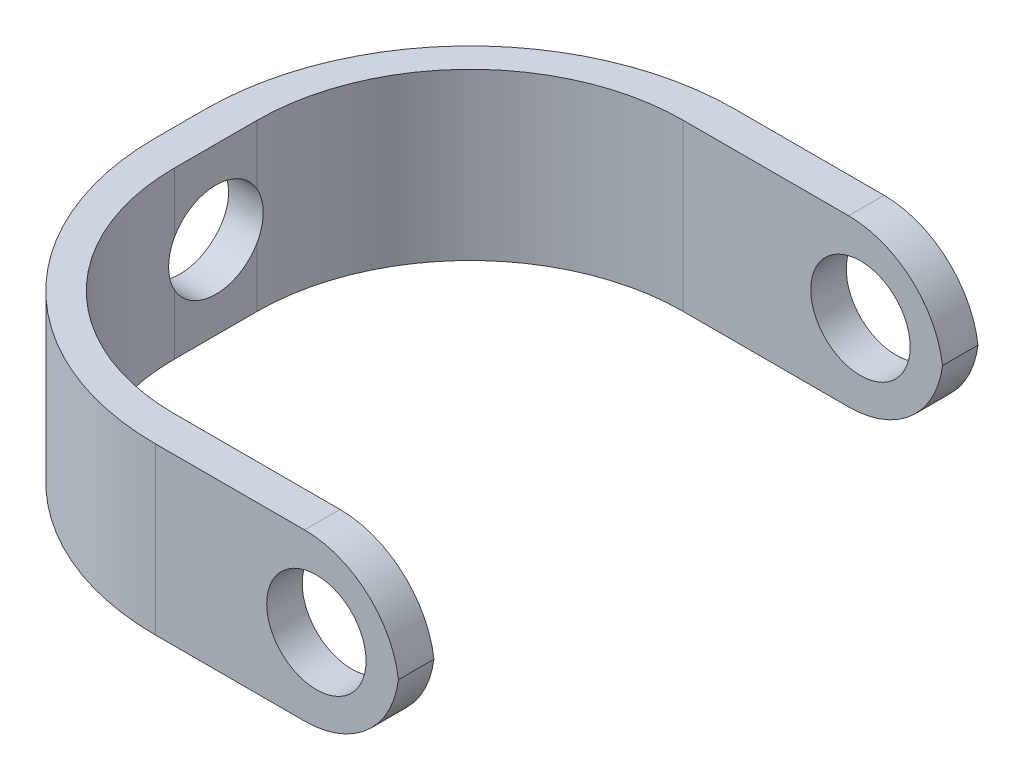
ISO-10303-21;
HEADER;
FILE_DESCRIPTION(('STEP AP214'),'2;1');
FILE_NAME('part.step','',(''),(''),'','','');
FILE_SCHEMA(('AUTOMOTIVE_DESIGN { 1 0 10303 214 1 1 1 1 }'));
ENDSEC;
DATA;
#1=APPLICATION_CONTEXT('core data for automotive mechanical design processes');
#2=APPLICATION_PROTOCOL_DEFINITION('international standard','automotive_design',2000,#1);
#3=PRODUCT_CONTEXT('',#1,'mechanical');
#4=PRODUCT('Part','Part','',(#3));
#5=PRODUCT_RELATED_PRODUCT_CATEGORY('part','',(#4));
#6=PRODUCT_DEFINITION_FORMATION('','',#4);
#7=PRODUCT_DEFINITION_CONTEXT('part definition',#1,'design');
#8=PRODUCT_DEFINITION('design','',#6,#7);
#9=PRODUCT_DEFINITION_SHAPE('','',#8);
#10=(LENGTH_UNIT() NAMED_UNIT(*) SI_UNIT(.MILLI.,.METRE.));
#11=(NAMED_UNIT(*) PLANE_ANGLE_UNIT() SI_UNIT($,.RADIAN.));
#12=(NAMED_UNIT(*) SI_UNIT($,.STERADIAN.) SOLID_ANGLE_UNIT());
#13=UNCERTAINTY_MEASURE_WITH_UNIT(LENGTH_MEASURE(1.E-05),#10,'distance_accuracy_value','');
#14=(GEOMETRIC_REPRESENTATION_CONTEXT(3) GLOBAL_UNCERTAINTY_ASSIGNED_CONTEXT((#13)) GLOBAL_UNIT_ASSIGNED_CONTEXT((#10,
#11,#12)) REPRESENTATION_CONTEXT('',''));
#15=CARTESIAN_POINT('',(0.,0.,0.));
#16=DIRECTION('',(0.,0.,1.));
#17=DIRECTION('',(1.,0.,0.));
#18=AXIS2_PLACEMENT_3D('',#15,#16,#17);
#19=CARTESIAN_POINT('',(-20.,7.,1.75));
#20=DIRECTION('',(-1.,0.,0.));
#21=DIRECTION('',(0.,0.,1.));
#22=AXIS2_PLACEMENT_3D('',#19,#20,#21);
#23=PLANE('',#22);
#24=DIRECTION('',(0.,-1.,0.));
#25=VECTOR('',#24,1.);
#26=CARTESIAN_POINT('',(-20.,7.,1.75));
#27=LINE('',#26,#25);
#28=CARTESIAN_POINT('',(-20.,7.,1.75));
#29=VERTEX_POINT('',#28);
#30=CARTESIAN_POINT('',(-20.,4.46824583655186,1.75));
#31=VERTEX_POINT('',#30);
#32=EDGE_CURVE('E201',#29,#31,#27,.T.);
#33=ORIENTED_EDGE('',*,*,#32,.T.);
#34=CARTESIAN_POINT('',(-20.,3.5,0.));
#35=DIRECTION('',(-1.,0.,0.));
#36=DIRECTION('',(0.,0.,1.));
#37=AXIS2_PLACEMENT_3D('',#34,#35,#36);
#38=CIRCLE('',#37,2.);
#39=CARTESIAN_POINT('',(-20.,4.46824583655185,-1.75));
#40=VERTEX_POINT('',#39);
#41=EDGE_CURVE('E243',#31,#40,#38,.T.);
#42=ORIENTED_EDGE('',*,*,#41,.T.);
#43=DIRECTION('',(0.,-1.,0.));
#44=VECTOR('',#43,1.);
#45=CARTESIAN_POINT('',(-20.,7.,-1.75));
#46=LINE('',#45,#44);
#47=CARTESIAN_POINT('',(-20.,7.,-1.75));
#48=VERTEX_POINT('',#47);
#49=EDGE_CURVE('E197',#48,#40,#46,.T.);
#50=ORIENTED_EDGE('',*,*,#49,.F.);
#51=DIRECTION('',(0.,0.,-1.));
#52=VECTOR('',#51,1.);
#53=CARTESIAN_POINT('',(-20.,7.,1.75));
#54=LINE('',#53,#52);
#55=EDGE_CURVE('E302',#29,#48,#54,.T.);
#56=ORIENTED_EDGE('',*,*,#55,.F.);
#57=EDGE_LOOP('',(#33,#42,#50,#56));
#58=FACE_BOUND('',#57,.T.);
#59=ADVANCED_FACE('F35',(#58),#23,.F.);
#60=CARTESIAN_POINT('',(-21.5,7.,1.05));
#61=DIRECTION('',(1.,0.,0.));
#62=DIRECTION('',(0.,0.,-1.));
#63=AXIS2_PLACEMENT_3D('',#60,#61,#62);
#64=PLANE('',#63);
#65=DIRECTION('',(0.,-1.,0.));
#66=VECTOR('',#65,1.);
#67=CARTESIAN_POINT('',(-21.5,7.,-1.05));
#68=LINE('',#67,#66);
#69=CARTESIAN_POINT('',(-21.5,7.,-1.05));
#70=VERTEX_POINT('',#69);
#71=CARTESIAN_POINT('',(-21.5,5.20220445305492,-1.05));
#72=VERTEX_POINT('',#71);
#73=EDGE_CURVE('E176',#70,#72,#68,.T.);
#74=ORIENTED_EDGE('',*,*,#73,.T.);
#75=CARTESIAN_POINT('',(-21.5,3.5,0.));
#76=DIRECTION('',(1.,0.,0.));
#77=DIRECTION('',(0.,0.,-1.));
#78=AXIS2_PLACEMENT_3D('',#75,#76,#77);
#79=CIRCLE('',#78,2.);
#80=CARTESIAN_POINT('',(-21.5,5.20220445305492,1.05));
#81=VERTEX_POINT('',#80);
#82=EDGE_CURVE('E163',#72,#81,#79,.T.);
#83=ORIENTED_EDGE('',*,*,#82,.T.);
#84=DIRECTION('',(0.,-1.,0.));
#85=VECTOR('',#84,1.);
#86=CARTESIAN_POINT('',(-21.5,7.,1.05));
#87=LINE('',#86,#85);
#88=CARTESIAN_POINT('',(-21.5,7.,1.05));
#89=VERTEX_POINT('',#88);
#90=EDGE_CURVE('E173',#89,#81,#87,.T.);
#91=ORIENTED_EDGE('',*,*,#90,.F.);
#92=DIRECTION('',(0.,0.,1.));
#93=VECTOR('',#92,1.);
#94=CARTESIAN_POINT('',(-21.5,7.,1.05));
#95=LINE('',#94,#93);
#96=EDGE_CURVE('E329',#70,#89,#95,.T.);
#97=ORIENTED_EDGE('',*,*,#96,.F.);
#98=EDGE_LOOP('',(#74,#83,#91,#97));
#99=FACE_BOUND('',#98,.T.);
#100=ADVANCED_FACE('F171',(#99),#64,.F.);
#101=CARTESIAN_POINT('',(-11.,7.,1.75));
#102=DIRECTION('',(0.,-1.,0.));
#103=DIRECTION('',(0.,0.,-1.));
#104=AXIS2_PLACEMENT_3D('',#101,#102,#103);
#105=CYLINDRICAL_SURFACE('',#104,9.);
#106=CARTESIAN_POINT('',(-20.,2.53175416344814,1.75));
#107=VERTEX_POINT('',#106);
#108=CARTESIAN_POINT('',(-20.,0.,1.75));
#109=VERTEX_POINT('',#108);
#110=EDGE_CURVE('E200',#107,#109,#27,.T.);
#111=ORIENTED_EDGE('',*,*,#110,.F.);
#112=CARTESIAN_POINT('',(-20.,2.53175416344815,1.75));
#113=CARTESIAN_POINT('',(-19.9999983319113,2.58100578583842,1.77724979694571));
#114=CARTESIAN_POINT('',(-19.9998765303259,2.63138445703074,1.80240647201058));
#115=CARTESIAN_POINT('',(-19.9994918342683,2.73407841232289,1.84838636903518));
#116=CARTESIAN_POINT('',(-19.9992289468443,2.78639359955629,1.86920980740354));
#117=CARTESIAN_POINT('',(-19.9983787584572,2.94551666564798,1.92487277309031));
#118=CARTESIAN_POINT('',(-19.9977289572329,3.05474491656143,1.95303898474004));
#119=CARTESIAN_POINT('',(-19.9968019687139,3.27641633126759,1.99064644324962));
#120=CARTESIAN_POINT('',(-19.9965250773654,3.38886197624385,2.00007282074966));
#121=CARTESIAN_POINT('',(-19.9965291616056,3.61374041847298,1.99992633269366));
#122=CARTESIAN_POINT('',(-19.9968101322298,3.72617321583127,1.99035363621022));
#123=CARTESIAN_POINT('',(-19.9977405158543,3.94736913681563,1.95253123382938));
#124=CARTESIAN_POINT('',(-19.9983882238339,4.05614679196625,1.92436785919604));
#125=CARTESIAN_POINT('',(-19.9992341003739,4.21462113580271,1.86881547433879));
#126=CARTESIAN_POINT('',(-19.9994953488382,4.26672345368725,1.84804725489505));
#127=CARTESIAN_POINT('',(-19.9998774796492,4.3690053654133,1.80221180852095));
#128=CARTESIAN_POINT('',(-19.9999983546021,4.4191848578425,1.77714435522415));
#129=CARTESIAN_POINT('',(-20.,4.46824583655185,1.75));
#130=B_SPLINE_CURVE_WITH_KNOTS('',3,(#112,#113,#114,#115,#116,#117,#118,#119,#120,#121,#122,
#123,#124,#125,#126,#127,#128,#129),.UNSPECIFIED.,.F.,.F.,(4,2,2,2,2,2,2,2,4),(0.,
0.168758200546729,0.337507971020978,0.67418591173675,1.01113088739505,1.34807286459634,
1.68346105787938,1.85155816559455,2.01966412680174),.UNSPECIFIED.);
#131=EDGE_CURVE('E238',#107,#31,#130,.T.);
#132=ORIENTED_EDGE('',*,*,#131,.T.);
#133=ORIENTED_EDGE('',*,*,#32,.F.);
#134=CARTESIAN_POINT('',(-11.,7.,1.75));
#135=DIRECTION('',(0.,-1.,0.));
#136=DIRECTION('',(0.,0.,1.));
#137=AXIS2_PLACEMENT_3D('',#134,#135,#136);
#138=CIRCLE('',#137,9.);
#139=CARTESIAN_POINT('',(-11.,7.,10.75));
#140=VERTEX_POINT('',#139);
#141=EDGE_CURVE('E306',#140,#29,#138,.T.);
#142=ORIENTED_EDGE('',*,*,#141,.F.);
#143=DIRECTION('',(0.,-1.,0.));
#144=VECTOR('',#143,1.);
#145=CARTESIAN_POINT('',(-11.,7.,10.75));
#146=LINE('',#145,#144);
#147=CARTESIAN_POINT('',(-11.,0.,10.75));
#148=VERTEX_POINT('',#147);
#149=EDGE_CURVE('E309',#140,#148,#146,.T.);
#150=ORIENTED_EDGE('',*,*,#149,.T.);
#151=CARTESIAN_POINT('',(-11.,0.,1.75));
#152=DIRECTION('',(0.,-1.,0.));
#153=DIRECTION('',(0.,0.,1.));
#154=AXIS2_PLACEMENT_3D('',#151,#152,#153);
#155=CIRCLE('',#154,9.);
#156=EDGE_CURVE('E337',#148,#109,#155,.T.);
#157=ORIENTED_EDGE('',*,*,#156,.T.);
#158=EDGE_LOOP('',(#111,#132,#133,#142,#150,#157));
#159=FACE_BOUND('',#158,.T.);
#160=ADVANCED_FACE('F257',(#159),#105,.F.);
#161=CARTESIAN_POINT('',(-20.,2.53175416344815,-1.75));
#162=VERTEX_POINT('',#161);
#163=CARTESIAN_POINT('',(-20.,0.,-1.75));
#164=VERTEX_POINT('',#163);
#165=EDGE_CURVE('E196',#162,#164,#46,.T.);
#166=ORIENTED_EDGE('',*,*,#165,.F.);
#167=EDGE_CURVE('E55',#162,#107,#38,.T.);
#168=ORIENTED_EDGE('',*,*,#167,.T.);
#169=ORIENTED_EDGE('',*,*,#110,.T.);
#170=DIRECTION('',(0.,0.,-1.));
#171=VECTOR('',#170,1.);
#172=CARTESIAN_POINT('',(-20.,0.,1.75));
#173=LINE('',#172,#171);
#174=EDGE_CURVE('E339',#109,#164,#173,.T.);
#175=ORIENTED_EDGE('',*,*,#174,.T.);
#176=EDGE_LOOP('',(#166,#168,#169,#175));
#177=FACE_BOUND('',#176,.T.);
#178=ADVANCED_FACE('F285',(#177),#23,.F.);
#179=CARTESIAN_POINT('',(-11.,7.,-1.75));
#180=DIRECTION('',(0.,-1.,0.));
#181=DIRECTION('',(0.,0.,-1.));
#182=AXIS2_PLACEMENT_3D('',#179,#180,#181);
#183=CYLINDRICAL_SURFACE('',#182,9.);
#184=ORIENTED_EDGE('',*,*,#49,.T.);
#185=CARTESIAN_POINT('',(-20.,4.46824583655185,-1.75));
#186=CARTESIAN_POINT('',(-19.9999983319113,4.41899421416158,-1.77724979694571));
#187=CARTESIAN_POINT('',(-19.9998765303259,4.36861554296926,-1.80240647201057));
#188=CARTESIAN_POINT('',(-19.9994918342683,4.26592158767711,-1.84838636903518));
#189=CARTESIAN_POINT('',(-19.9992289468443,4.21360640044371,-1.86920980740353));
#190=CARTESIAN_POINT('',(-19.9983787584572,4.05448333435202,-1.9248727730903));
#191=CARTESIAN_POINT('',(-19.9977289572329,3.94525508343857,-1.95303898474004));
#192=CARTESIAN_POINT('',(-19.9968019687139,3.72358366873241,-1.99064644324962));
#193=CARTESIAN_POINT('',(-19.9965250773654,3.61113802375615,-2.00007282074965));
#194=CARTESIAN_POINT('',(-19.9965291616056,3.38625958152702,-1.99992633269366));
#195=CARTESIAN_POINT('',(-19.9968101322298,3.27382678416873,-1.99035363621022));
#196=CARTESIAN_POINT('',(-19.9977405158543,3.05263086318437,-1.95253123382938));
#197=CARTESIAN_POINT('',(-19.9983882238339,2.94385320803375,-1.92436785919603));
#198=CARTESIAN_POINT('',(-19.9992341003739,2.78537886419729,-1.86881547433879));
#199=CARTESIAN_POINT('',(-19.9994953488382,2.73327654631275,-1.84804725489505));
#200=CARTESIAN_POINT('',(-19.9998774796492,2.6309946345867,-1.80221180852095));
#201=CARTESIAN_POINT('',(-19.9999983546021,2.5808151421575,-1.77714435522415));
#202=CARTESIAN_POINT('',(-20.,2.53175416344814,-1.75));
#203=B_SPLINE_CURVE_WITH_KNOTS('',3,(#185,#186,#187,#188,#189,#190,#191,#192,#193,#194,#195,
#196,#197,#198,#199,#200,#201,#202),.UNSPECIFIED.,.F.,.F.,(4,2,2,2,2,2,2,2,4),(0.,
0.168758200546729,0.337507971020978,0.67418591173675,1.01113088739505,1.34807286459634,
1.68346105787938,1.85155816559455,2.01966412680175),.UNSPECIFIED.);
#204=EDGE_CURVE('E275',#40,#162,#203,.T.);
#205=ORIENTED_EDGE('',*,*,#204,.T.);
#206=ORIENTED_EDGE('',*,*,#165,.T.);
#207=CARTESIAN_POINT('',(-11.,0.,-1.75));
#208=DIRECTION('',(0.,-1.,0.));
#209=DIRECTION('',(0.,0.,-1.));
#210=AXIS2_PLACEMENT_3D('',#207,#208,#209);
#211=CIRCLE('',#210,9.);
#212=CARTESIAN_POINT('',(-11.,0.,-10.75));
#213=VERTEX_POINT('',#212);
#214=EDGE_CURVE('E342',#164,#213,#211,.T.);
#215=ORIENTED_EDGE('',*,*,#214,.T.);
#216=DIRECTION('',(0.,-1.,0.));
#217=VECTOR('',#216,1.);
#218=CARTESIAN_POINT('',(-11.,7.,-10.75));
#219=LINE('',#218,#217);
#220=CARTESIAN_POINT('',(-11.,7.,-10.75));
#221=VERTEX_POINT('',#220);
#222=EDGE_CURVE('E193',#221,#213,#219,.T.);
#223=ORIENTED_EDGE('',*,*,#222,.F.);
#224=CARTESIAN_POINT('',(-11.,7.,-1.75));
#225=DIRECTION('',(0.,-1.,0.));
#226=DIRECTION('',(0.,0.,-1.));
#227=AXIS2_PLACEMENT_3D('',#224,#225,#226);
#228=CIRCLE('',#227,9.);
#229=EDGE_CURVE('E314',#48,#221,#228,.T.);
#230=ORIENTED_EDGE('',*,*,#229,.F.);
#231=EDGE_LOOP('',(#184,#205,#206,#215,#223,#230));
#232=FACE_BOUND('',#231,.T.);
#233=ADVANCED_FACE('F280',(#232),#183,.F.);
#234=CARTESIAN_POINT('',(0.,7.,-10.75));
#235=DIRECTION('',(0.,0.,-1.));
#236=DIRECTION('',(-1.,0.,0.));
#237=AXIS2_PLACEMENT_3D('',#234,#235,#236);
#238=PLANE('',#237);
#239=CARTESIAN_POINT('',(-3.5,3.5,-10.75));
#240=DIRECTION('',(0.,0.,-1.));
#241=DIRECTION('',(-1.,0.,0.));
#242=AXIS2_PLACEMENT_3D('',#239,#240,#241);
#243=CIRCLE('',#242,2.1);
#244=CARTESIAN_POINT('',(-5.6,3.5,-10.75));
#245=VERTEX_POINT('',#244);
#246=EDGE_CURVE('E319',#245,#245,#243,.T.);
#247=ORIENTED_EDGE('',*,*,#246,.T.);
#248=EDGE_LOOP('',(#247));
#249=FACE_BOUND('',#248,.T.);
#250=DIRECTION('',(1.,0.,0.));
#251=VECTOR('',#250,1.);
#252=CARTESIAN_POINT('',(0.,0.,-10.75));
#253=LINE('',#252,#251);
#254=CARTESIAN_POINT('',(-4.,0.,-10.75));
#255=VERTEX_POINT('',#254);
#256=EDGE_CURVE('E344',#213,#255,#253,.T.);
#257=ORIENTED_EDGE('',*,*,#256,.T.);
#258=CARTESIAN_POINT('',(-4.,4.,-10.75));
#259=DIRECTION('',(0.,0.,-1.));
#260=DIRECTION('',(-1.,0.,0.));
#261=AXIS2_PLACEMENT_3D('',#258,#259,#260);
#262=CIRCLE('',#261,4.);
#263=CARTESIAN_POINT('',(-0.0313730334031139,3.5,-10.75));
#264=VERTEX_POINT('',#263);
#265=EDGE_CURVE('E221',#255,#264,#262,.F.);
#266=ORIENTED_EDGE('',*,*,#265,.T.);
#267=CARTESIAN_POINT('',(-4.,3.,-10.75));
#268=DIRECTION('',(0.,0.,-1.));
#269=DIRECTION('',(-1.,0.,0.));
#270=AXIS2_PLACEMENT_3D('',#267,#268,#269);
#271=CIRCLE('',#270,4.);
#272=CARTESIAN_POINT('',(-4.,7.,-10.75));
#273=VERTEX_POINT('',#272);
#274=EDGE_CURVE('E219',#264,#273,#271,.F.);
#275=ORIENTED_EDGE('',*,*,#274,.T.);
#276=DIRECTION('',(1.,0.,0.));
#277=VECTOR('',#276,1.);
#278=CARTESIAN_POINT('',(0.,7.,-10.75));
#279=LINE('',#278,#277);
#280=EDGE_CURVE('E322',#221,#273,#279,.T.);
#281=ORIENTED_EDGE('',*,*,#280,.F.);
#282=ORIENTED_EDGE('',*,*,#222,.T.);
#283=EDGE_LOOP('',(#257,#266,#275,#281,#282));
#284=FACE_BOUND('',#283,.T.);
#285=ADVANCED_FACE('F284',(#249,#284),#238,.F.);
#286=CARTESIAN_POINT('',(0.,7.,-12.25));
#287=DIRECTION('',(0.,0.,1.));
#288=DIRECTION('',(1.,0.,0.));
#289=AXIS2_PLACEMENT_3D('',#286,#287,#288);
#290=PLANE('',#289);
#291=CARTESIAN_POINT('',(-3.5,3.5,-12.25));
#292=DIRECTION('',(0.,0.,1.));
#293=DIRECTION('',(1.,0.,0.));
#294=AXIS2_PLACEMENT_3D('',#291,#292,#293);
#295=CIRCLE('',#294,2.1);
#296=CARTESIAN_POINT('',(-1.4,3.5,-12.25));
#297=VERTEX_POINT('',#296);
#298=EDGE_CURVE('E209',#297,#297,#295,.T.);
#299=ORIENTED_EDGE('',*,*,#298,.T.);
#300=EDGE_LOOP('',(#299));
#301=FACE_BOUND('',#300,.T.);
#302=CARTESIAN_POINT('',(-4.,3.,-12.25));
#303=DIRECTION('',(0.,0.,1.));
#304=DIRECTION('',(1.,0.,0.));
#305=AXIS2_PLACEMENT_3D('',#302,#303,#304);
#306=CIRCLE('',#305,4.);
#307=CARTESIAN_POINT('',(-4.,7.,-12.25));
#308=VERTEX_POINT('',#307);
#309=CARTESIAN_POINT('',(-0.0313730334031139,3.5,-12.25));
#310=VERTEX_POINT('',#309);
#311=EDGE_CURVE('E204',#308,#310,#306,.F.);
#312=ORIENTED_EDGE('',*,*,#311,.T.);
#313=CARTESIAN_POINT('',(-4.,4.,-12.25));
#314=DIRECTION('',(0.,0.,1.));
#315=DIRECTION('',(1.,0.,0.));
#316=AXIS2_PLACEMENT_3D('',#313,#314,#315);
#317=CIRCLE('',#316,4.);
#318=CARTESIAN_POINT('',(-4.,0.,-12.25));
#319=VERTEX_POINT('',#318);
#320=EDGE_CURVE('E211',#310,#319,#317,.F.);
#321=ORIENTED_EDGE('',*,*,#320,.T.);
#322=DIRECTION('',(-1.,0.,0.));
#323=VECTOR('',#322,1.);
#324=CARTESIAN_POINT('',(0.,0.,-12.25));
#325=LINE('',#324,#323);
#326=CARTESIAN_POINT('',(-10.3,0.,-12.25));
#327=VERTEX_POINT('',#326);
#328=EDGE_CURVE('E347',#319,#327,#325,.T.);
#329=ORIENTED_EDGE('',*,*,#328,.T.);
#330=DIRECTION('',(0.,-1.,0.));
#331=VECTOR('',#330,1.);
#332=CARTESIAN_POINT('',(-10.3,7.,-12.25));
#333=LINE('',#332,#331);
#334=CARTESIAN_POINT('',(-10.3,7.,-12.25));
#335=VERTEX_POINT('',#334);
#336=EDGE_CURVE('E190',#335,#327,#333,.T.);
#337=ORIENTED_EDGE('',*,*,#336,.F.);
#338=DIRECTION('',(-1.,0.,0.));
#339=VECTOR('',#338,1.);
#340=CARTESIAN_POINT('',(0.,7.,-12.25));
#341=LINE('',#340,#339);
#342=EDGE_CURVE('E325',#308,#335,#341,.T.);
#343=ORIENTED_EDGE('',*,*,#342,.F.);
#344=EDGE_LOOP('',(#312,#321,#329,#337,#343));
#345=FACE_BOUND('',#344,.T.);
#346=ADVANCED_FACE('F395',(#301,#345),#290,.F.);
#347=CARTESIAN_POINT('',(-10.3,7.,-1.05));
#348=DIRECTION('',(0.,-1.,0.));
#349=DIRECTION('',(0.,0.,-1.));
#350=AXIS2_PLACEMENT_3D('',#347,#348,#349);
#351=CYLINDRICAL_SURFACE('',#350,11.2);
#352=CARTESIAN_POINT('',(-21.5,1.79779554694508,-1.05));
#353=VERTEX_POINT('',#352);
#354=CARTESIAN_POINT('',(-21.5,0.,-1.05));
#355=VERTEX_POINT('',#354);
#356=EDGE_CURVE('E182',#353,#355,#68,.T.);
#357=ORIENTED_EDGE('',*,*,#356,.F.);
#358=CARTESIAN_POINT('',(-21.5,1.79779554694508,-1.05));
#359=CARTESIAN_POINT('',(-21.500001006194,1.82729464814979,-1.09782207177187));
#360=CARTESIAN_POINT('',(-21.4996935596627,1.85879531857306,-1.14437662525518));
#361=CARTESIAN_POINT('',(-21.4985683343972,1.92559248466684,-1.23466482026564));
#362=CARTESIAN_POINT('',(-21.497750602794,1.96088862953042,-1.27839872190237));
#363=CARTESIAN_POINT('',(-21.4946951080513,2.07204452952168,-1.40481309714987));
#364=CARTESIAN_POINT('',(-21.4918543362726,2.15327140896568,-1.48286742056163));
#365=CARTESIAN_POINT('',(-21.485494573344,2.32761902787597,-1.62423525247025));
#366=CARTESIAN_POINT('',(-21.4819753788213,2.42074333103834,-1.68754432814164));
#367=CARTESIAN_POINT('',(-21.4751527360926,2.61628144204361,-1.79767134118249));
#368=CARTESIAN_POINT('',(-21.4718492492984,2.71869358049576,-1.84449223477104));
#369=CARTESIAN_POINT('',(-21.4661921202344,2.93019862230445,-1.92041251935365));
#370=CARTESIAN_POINT('',(-21.4638408423351,3.0393073902018,-1.94946788788796));
#371=CARTESIAN_POINT('',(-21.4605990141759,3.26089889248673,-1.98884250529057));
#372=CARTESIAN_POINT('',(-21.4597087212724,3.37338221775893,-1.99915845319365));
#373=CARTESIAN_POINT('',(-21.4595740956902,3.59812865293917,-2.0007401061238));
#374=CARTESIAN_POINT('',(-21.4603246109129,3.71039134748519,-1.9920654411102));
#375=CARTESIAN_POINT('',(-21.4633064462787,3.93183730259336,-1.9560407330751));
#376=CARTESIAN_POINT('',(-21.4655374599457,4.04102119561876,-1.92869455518622));
#377=CARTESIAN_POINT('',(-21.4710093360062,4.25319882575731,-1.85614289603453));
#378=CARTESIAN_POINT('',(-21.4742498650809,4.3561945926773,-1.81094330823863));
#379=CARTESIAN_POINT('',(-21.4810231146473,4.55323079623454,-1.70389590222672));
#380=CARTESIAN_POINT('',(-21.4845559150002,4.64726877001283,-1.64204352326931));
#381=CARTESIAN_POINT('',(-21.4894837171948,4.78154363465838,-1.53658770482052));
#382=CARTESIAN_POINT('',(-21.4910953931543,4.82606938729702,-1.49832761823994));
#383=CARTESIAN_POINT('',(-21.4940238832221,4.91160760412651,-1.41802707387438));
#384=CARTESIAN_POINT('',(-21.4953406838244,4.95261990734145,-1.37598644305669));
#385=CARTESIAN_POINT('',(-21.4975479922896,5.03083828936127,-1.2884041426001));
#386=CARTESIAN_POINT('',(-21.4984379810363,5.0680396900937,-1.24285828738131));
#387=CARTESIAN_POINT('',(-21.4996649311625,5.13830019257467,-1.14866519310473));
#388=CARTESIAN_POINT('',(-21.5000018563093,5.17135902280136,-1.1000177510706));
#389=CARTESIAN_POINT('',(-21.5,5.20220445305492,-1.05));
#390=B_SPLINE_CURVE_WITH_KNOTS('',3,(#358,#359,#360,#361,#362,#363,#364,#365,#366,#367,#368,
#369,#370,#371,#372,#373,#374,#375,#376,#377,#378,#379,#380,#381,#382,#383,#384,#385,#386,#387,
#388,#389),.UNSPECIFIED.,.F.,.F.,(4,2,2,2,2,2,2,2,2,2,2,2,2,2,2,4),(0.,0.168459815989146,
0.336904074988638,0.67323136373283,1.00965963154308,1.34602754930217,1.68322563440236,
2.02048311148042,2.35668312941717,2.69281357271081,3.02883315089096,3.36494484936689,
3.54093855451958,3.71694031887767,3.89315560843467,4.06938244186345),.UNSPECIFIED.);
#391=EDGE_CURVE('E177',#353,#72,#390,.T.);
#392=ORIENTED_EDGE('',*,*,#391,.T.);
#393=ORIENTED_EDGE('',*,*,#73,.F.);
#394=CARTESIAN_POINT('',(-10.3,7.,-1.05));
#395=DIRECTION('',(0.,1.,0.));
#396=DIRECTION('',(0.,0.,-1.));
#397=AXIS2_PLACEMENT_3D('',#394,#395,#396);
#398=CIRCLE('',#397,11.2);
#399=EDGE_CURVE('E327',#335,#70,#398,.T.);
#400=ORIENTED_EDGE('',*,*,#399,.F.);
#401=ORIENTED_EDGE('',*,*,#336,.T.);
#402=CARTESIAN_POINT('',(-10.3,0.,-1.05));
#403=DIRECTION('',(0.,1.,0.));
#404=DIRECTION('',(0.,0.,-1.));
#405=AXIS2_PLACEMENT_3D('',#402,#403,#404);
#406=CIRCLE('',#405,11.2);
#407=EDGE_CURVE('E349',#327,#355,#406,.T.);
#408=ORIENTED_EDGE('',*,*,#407,.T.);
#409=EDGE_LOOP('',(#357,#392,#393,#400,#401,#408));
#410=FACE_BOUND('',#409,.T.);
#411=ADVANCED_FACE('F391',(#410),#351,.T.);
#412=CARTESIAN_POINT('',(-21.5,1.79779554694508,1.05));
#413=VERTEX_POINT('',#412);
#414=CARTESIAN_POINT('',(-21.5,0.,1.05));
#415=VERTEX_POINT('',#414);
#416=EDGE_CURVE('E183',#413,#415,#87,.T.);
#417=ORIENTED_EDGE('',*,*,#416,.F.);
#418=EDGE_CURVE('E63',#413,#353,#79,.T.);
#419=ORIENTED_EDGE('',*,*,#418,.T.);
#420=ORIENTED_EDGE('',*,*,#356,.T.);
#421=DIRECTION('',(0.,0.,1.));
#422=VECTOR('',#421,1.);
#423=CARTESIAN_POINT('',(-21.5,0.,1.05));
#424=LINE('',#423,#422);
#425=EDGE_CURVE('E352',#355,#415,#424,.T.);
#426=ORIENTED_EDGE('',*,*,#425,.T.);
#427=EDGE_LOOP('',(#417,#419,#420,#426));
#428=FACE_BOUND('',#427,.T.);
#429=ADVANCED_FACE('F300',(#428),#64,.F.);
#430=CARTESIAN_POINT('',(-10.3,7.,1.05));
#431=DIRECTION('',(0.,-1.,0.));
#432=DIRECTION('',(0.,0.,-1.));
#433=AXIS2_PLACEMENT_3D('',#430,#431,#432);
#434=CYLINDRICAL_SURFACE('',#433,11.2);
#435=ORIENTED_EDGE('',*,*,#90,.T.);
#436=CARTESIAN_POINT('',(-21.5,5.20220445305492,1.05));
#437=CARTESIAN_POINT('',(-21.500001006194,5.17270535185021,1.09782207177188));
#438=CARTESIAN_POINT('',(-21.4996935596627,5.14120468142694,1.14437662525519));
#439=CARTESIAN_POINT('',(-21.4985683343972,5.07440751533316,1.23466482026564));
#440=CARTESIAN_POINT('',(-21.497750602794,5.03911137046958,1.27839872190238));
#441=CARTESIAN_POINT('',(-21.4946951080513,4.92795547047832,1.40481309714988));
#442=CARTESIAN_POINT('',(-21.4918543362726,4.84672859103432,1.48286742056163));
#443=CARTESIAN_POINT('',(-21.485494573344,4.67238097212403,1.62423525247026));
#444=CARTESIAN_POINT('',(-21.4819753788213,4.57925666896166,1.68754432814165));
#445=CARTESIAN_POINT('',(-21.4751527360926,4.38371855795639,1.7976713411825));
#446=CARTESIAN_POINT('',(-21.4718492492984,4.28130641950424,1.84449223477104));
#447=CARTESIAN_POINT('',(-21.4661921202344,4.06980137769554,1.92041251935366));
#448=CARTESIAN_POINT('',(-21.4638408423351,3.96069260979819,1.94946788788797));
#449=CARTESIAN_POINT('',(-21.4605990141759,3.73910110751327,1.98884250529057));
#450=CARTESIAN_POINT('',(-21.4597087212724,3.62661778224106,1.99915845319365));
#451=CARTESIAN_POINT('',(-21.4595740956902,3.40187134706083,2.00074010612381));
#452=CARTESIAN_POINT('',(-21.4603246109129,3.28960865251481,1.99206544111021));
#453=CARTESIAN_POINT('',(-21.4633064462787,3.06816269740664,1.95604073307511));
#454=CARTESIAN_POINT('',(-21.4655374599457,2.95897880438124,1.92869455518623));
#455=CARTESIAN_POINT('',(-21.4710093360062,2.74680117424269,1.85614289603453));
#456=CARTESIAN_POINT('',(-21.4742498650809,2.6438054073227,1.81094330823864));
#457=CARTESIAN_POINT('',(-21.4810231146473,2.44676920376546,1.70389590222672));
#458=CARTESIAN_POINT('',(-21.4845559150002,2.35273122998717,1.64204352326931));
#459=CARTESIAN_POINT('',(-21.4894837171948,2.21845636534162,1.53658770482052));
#460=CARTESIAN_POINT('',(-21.4910953931543,2.17393061270298,1.49832761823994));
#461=CARTESIAN_POINT('',(-21.4940238832221,2.08839239587349,1.41802707387438));
#462=CARTESIAN_POINT('',(-21.4953406838244,2.04738009265855,1.3759864430567));
#463=CARTESIAN_POINT('',(-21.4975479922896,1.96916171063873,1.2884041426001));
#464=CARTESIAN_POINT('',(-21.4984379810363,1.9319603099063,1.24285828738131));
#465=CARTESIAN_POINT('',(-21.4996649311625,1.86169980742533,1.14866519310473));
#466=CARTESIAN_POINT('',(-21.5000018563093,1.82864097719864,1.10001775107061));
#467=CARTESIAN_POINT('',(-21.5,1.79779554694508,1.05));
#468=B_SPLINE_CURVE_WITH_KNOTS('',3,(#436,#437,#438,#439,#440,#441,#442,#443,#444,#445,#446,
#447,#448,#449,#450,#451,#452,#453,#454,#455,#456,#457,#458,#459,#460,#461,#462,#463,#464,#465,
#466,#467),.UNSPECIFIED.,.F.,.F.,(4,2,2,2,2,2,2,2,2,2,2,2,2,2,2,4),(0.,0.168459815989146,
0.336904074988638,0.673231363732829,1.00965963154308,1.34602754930217,1.68322563440236,
2.02048311148042,2.35668312941717,2.69281357271081,3.02883315089096,3.36494484936689,
3.54093855451958,3.71694031887767,3.89315560843467,4.06938244186345),.UNSPECIFIED.);
#469=EDGE_CURVE('E11',#81,#413,#468,.T.);
#470=ORIENTED_EDGE('',*,*,#469,.T.);
#471=ORIENTED_EDGE('',*,*,#416,.T.);
#472=CARTESIAN_POINT('',(-10.3,0.,1.05));
#473=DIRECTION('',(0.,1.,0.));
#474=DIRECTION('',(0.,0.,1.));
#475=AXIS2_PLACEMENT_3D('',#472,#473,#474);
#476=CIRCLE('',#475,11.2);
#477=CARTESIAN_POINT('',(-10.3,0.,12.25));
#478=VERTEX_POINT('',#477);
#479=EDGE_CURVE('E355',#415,#478,#476,.T.);
#480=ORIENTED_EDGE('',*,*,#479,.T.);
#481=DIRECTION('',(0.,-1.,0.));
#482=VECTOR('',#481,1.);
#483=CARTESIAN_POINT('',(-10.3,7.,12.25));
#484=LINE('',#483,#482);
#485=CARTESIAN_POINT('',(-10.3,7.,12.25));
#486=VERTEX_POINT('',#485);
#487=EDGE_CURVE('E186',#486,#478,#484,.T.);
#488=ORIENTED_EDGE('',*,*,#487,.F.);
#489=CARTESIAN_POINT('',(-10.3,7.,1.05));
#490=DIRECTION('',(0.,1.,0.));
#491=DIRECTION('',(0.,0.,1.));
#492=AXIS2_PLACEMENT_3D('',#489,#490,#491);
#493=CIRCLE('',#492,11.2);
#494=EDGE_CURVE('E181',#89,#486,#493,.T.);
#495=ORIENTED_EDGE('',*,*,#494,.F.);
#496=EDGE_LOOP('',(#435,#470,#471,#480,#488,#495));
#497=FACE_BOUND('',#496,.T.);
#498=ADVANCED_FACE('F179',(#497),#434,.T.);
#499=CARTESIAN_POINT('',(0.,7.,12.25));
#500=DIRECTION('',(0.,0.,-1.));
#501=DIRECTION('',(-1.,0.,0.));
#502=AXIS2_PLACEMENT_3D('',#499,#500,#501);
#503=PLANE('',#502);
#504=CARTESIAN_POINT('',(-3.5,3.5,12.25));
#505=DIRECTION('',(0.,0.,-1.));
#506=DIRECTION('',(-1.,0.,0.));
#507=AXIS2_PLACEMENT_3D('',#504,#505,#506);
#508=CIRCLE('',#507,2.1);
#509=CARTESIAN_POINT('',(-5.6,3.5,12.25));
#510=VERTEX_POINT('',#509);
#511=EDGE_CURVE('E208',#510,#510,#508,.T.);
#512=ORIENTED_EDGE('',*,*,#511,.T.);
#513=EDGE_LOOP('',(#512));
#514=FACE_BOUND('',#513,.T.);
#515=DIRECTION('',(1.,0.,0.));
#516=VECTOR('',#515,1.);
#517=CARTESIAN_POINT('',(0.,0.,12.25));
#518=LINE('',#517,#516);
#519=CARTESIAN_POINT('',(-4.,0.,12.25));
#520=VERTEX_POINT('',#519);
#521=EDGE_CURVE('E316',#478,#520,#518,.T.);
#522=ORIENTED_EDGE('',*,*,#521,.T.);
#523=CARTESIAN_POINT('',(-4.,4.,12.25));
#524=DIRECTION('',(0.,0.,-1.));
#525=DIRECTION('',(-1.,0.,0.));
#526=AXIS2_PLACEMENT_3D('',#523,#524,#525);
#527=CIRCLE('',#526,4.);
#528=CARTESIAN_POINT('',(-0.0313730334031122,3.5,12.25));
#529=VERTEX_POINT('',#528);
#530=EDGE_CURVE('E229',#520,#529,#527,.F.);
#531=ORIENTED_EDGE('',*,*,#530,.T.);
#532=CARTESIAN_POINT('',(-4.,3.,12.25));
#533=DIRECTION('',(0.,0.,-1.));
#534=DIRECTION('',(-1.,0.,0.));
#535=AXIS2_PLACEMENT_3D('',#532,#533,#534);
#536=CIRCLE('',#535,4.);
#537=CARTESIAN_POINT('',(-4.,7.,12.25));
#538=VERTEX_POINT('',#537);
#539=EDGE_CURVE('E227',#529,#538,#536,.F.);
#540=ORIENTED_EDGE('',*,*,#539,.T.);
#541=DIRECTION('',(1.,0.,0.));
#542=VECTOR('',#541,1.);
#543=CARTESIAN_POINT('',(0.,7.,12.25));
#544=LINE('',#543,#542);
#545=EDGE_CURVE('E332',#486,#538,#544,.T.);
#546=ORIENTED_EDGE('',*,*,#545,.F.);
#547=ORIENTED_EDGE('',*,*,#487,.T.);
#548=EDGE_LOOP('',(#522,#531,#540,#546,#547));
#549=FACE_BOUND('',#548,.T.);
#550=ADVANCED_FACE('F362',(#514,#549),#503,.F.);
#551=CARTESIAN_POINT('',(0.,7.,10.75));
#552=DIRECTION('',(0.,0.,1.));
#553=DIRECTION('',(1.,0.,0.));
#554=AXIS2_PLACEMENT_3D('',#551,#552,#553);
#555=PLANE('',#554);
#556=CARTESIAN_POINT('',(-3.5,3.5,10.75));
#557=DIRECTION('',(0.,0.,1.));
#558=DIRECTION('',(1.,0.,0.));
#559=AXIS2_PLACEMENT_3D('',#556,#557,#558);
#560=CIRCLE('',#559,2.1);
#561=CARTESIAN_POINT('',(-1.4,3.5,10.75));
#562=VERTEX_POINT('',#561);
#563=EDGE_CURVE('E205',#562,#562,#560,.T.);
#564=ORIENTED_EDGE('',*,*,#563,.T.);
#565=EDGE_LOOP('',(#564));
#566=FACE_BOUND('',#565,.T.);
#567=CARTESIAN_POINT('',(-4.,3.,10.75));
#568=DIRECTION('',(0.,0.,1.));
#569=DIRECTION('',(1.,0.,0.));
#570=AXIS2_PLACEMENT_3D('',#567,#568,#569);
#571=CIRCLE('',#570,4.);
#572=CARTESIAN_POINT('',(-4.,7.,10.75));
#573=VERTEX_POINT('',#572);
#574=CARTESIAN_POINT('',(-0.0313730334031139,3.5,10.75));
#575=VERTEX_POINT('',#574);
#576=EDGE_CURVE('E223',#573,#575,#571,.F.);
#577=ORIENTED_EDGE('',*,*,#576,.T.);
#578=CARTESIAN_POINT('',(-4.,4.,10.75));
#579=DIRECTION('',(0.,0.,1.));
#580=DIRECTION('',(1.,0.,0.));
#581=AXIS2_PLACEMENT_3D('',#578,#579,#580);
#582=CIRCLE('',#581,4.);
#583=CARTESIAN_POINT('',(-4.,0.,10.75));
#584=VERTEX_POINT('',#583);
#585=EDGE_CURVE('E225',#575,#584,#582,.F.);
#586=ORIENTED_EDGE('',*,*,#585,.T.);
#587=DIRECTION('',(-1.,0.,0.));
#588=VECTOR('',#587,1.);
#589=CARTESIAN_POINT('',(0.,0.,10.75));
#590=LINE('',#589,#588);
#591=EDGE_CURVE('E312',#584,#148,#590,.T.);
#592=ORIENTED_EDGE('',*,*,#591,.T.);
#593=ORIENTED_EDGE('',*,*,#149,.F.);
#594=DIRECTION('',(-1.,0.,0.));
#595=VECTOR('',#594,1.);
#596=CARTESIAN_POINT('',(0.,7.,10.75));
#597=LINE('',#596,#595);
#598=EDGE_CURVE('E335',#573,#140,#597,.T.);
#599=ORIENTED_EDGE('',*,*,#598,.F.);
#600=EDGE_LOOP('',(#577,#586,#592,#593,#599));
#601=FACE_BOUND('',#600,.T.);
#602=ADVANCED_FACE('F377',(#566,#601),#555,.F.);
#603=CARTESIAN_POINT('',(-11.,7.,1.75));
#604=DIRECTION('',(0.,1.,0.));
#605=DIRECTION('',(0.,0.,1.));
#606=AXIS2_PLACEMENT_3D('',#603,#604,#605);
#607=PLANE('',#606);
#608=ORIENTED_EDGE('',*,*,#280,.T.);
#609=DIRECTION('',(0.,0.,-1.));
#610=VECTOR('',#609,1.);
#611=CARTESIAN_POINT('',(-4.,7.,-12.25));
#612=LINE('',#611,#610);
#613=EDGE_CURVE('E48',#273,#308,#612,.T.);
#614=ORIENTED_EDGE('',*,*,#613,.T.);
#615=ORIENTED_EDGE('',*,*,#342,.T.);
#616=ORIENTED_EDGE('',*,*,#399,.T.);
#617=ORIENTED_EDGE('',*,*,#96,.T.);
#618=ORIENTED_EDGE('',*,*,#494,.T.);
#619=ORIENTED_EDGE('',*,*,#545,.T.);
#620=DIRECTION('',(0.,0.,-1.));
#621=VECTOR('',#620,1.);
#622=CARTESIAN_POINT('',(-4.,7.,10.75));
#623=LINE('',#622,#621);
#624=EDGE_CURVE('E231',#538,#573,#623,.T.);
#625=ORIENTED_EDGE('',*,*,#624,.T.);
#626=ORIENTED_EDGE('',*,*,#598,.T.);
#627=ORIENTED_EDGE('',*,*,#141,.T.);
#628=ORIENTED_EDGE('',*,*,#55,.T.);
#629=ORIENTED_EDGE('',*,*,#229,.T.);
#630=EDGE_LOOP('',(#608,#614,#615,#616,#617,#618,#619,#625,#626,#627,#628,#629));
#631=FACE_BOUND('',#630,.T.);
#632=ADVANCED_FACE('F375',(#631),#607,.T.);
#633=CARTESIAN_POINT('',(-11.,0.,1.75));
#634=DIRECTION('',(0.,1.,0.));
#635=DIRECTION('',(0.,0.,1.));
#636=AXIS2_PLACEMENT_3D('',#633,#634,#635);
#637=PLANE('',#636);
#638=ORIENTED_EDGE('',*,*,#328,.F.);
#639=DIRECTION('',(0.,0.,-1.));
#640=VECTOR('',#639,1.);
#641=CARTESIAN_POINT('',(-4.,0.,1.75));
#642=LINE('',#641,#640);
#643=EDGE_CURVE('E216',#319,#255,#642,.F.);
#644=ORIENTED_EDGE('',*,*,#643,.T.);
#645=ORIENTED_EDGE('',*,*,#256,.F.);
#646=ORIENTED_EDGE('',*,*,#214,.F.);
#647=ORIENTED_EDGE('',*,*,#174,.F.);
#648=ORIENTED_EDGE('',*,*,#156,.F.);
#649=ORIENTED_EDGE('',*,*,#591,.F.);
#650=DIRECTION('',(0.,0.,-1.));
#651=VECTOR('',#650,1.);
#652=CARTESIAN_POINT('',(-4.00000000000001,0.,1.74999999999999));
#653=LINE('',#652,#651);
#654=EDGE_CURVE('E213',#584,#520,#653,.F.);
#655=ORIENTED_EDGE('',*,*,#654,.T.);
#656=ORIENTED_EDGE('',*,*,#521,.F.);
#657=ORIENTED_EDGE('',*,*,#479,.F.);
#658=ORIENTED_EDGE('',*,*,#425,.F.);
#659=ORIENTED_EDGE('',*,*,#407,.F.);
#660=EDGE_LOOP('',(#638,#644,#645,#646,#647,#648,#649,#655,#656,#657,#658,#659));
#661=FACE_BOUND('',#660,.T.);
#662=ADVANCED_FACE('F366',(#661),#637,.F.);
#663=CARTESIAN_POINT('',(-3.5,3.5,-12.25));
#664=DIRECTION('',(0.,0.,1.));
#665=DIRECTION('',(1.,0.,0.));
#666=AXIS2_PLACEMENT_3D('',#663,#664,#665);
#667=CYLINDRICAL_SURFACE('',#666,2.1);
#668=ORIENTED_EDGE('',*,*,#563,.F.);
#669=EDGE_LOOP('',(#668));
#670=FACE_BOUND('',#669,.T.);
#671=ORIENTED_EDGE('',*,*,#511,.F.);
#672=EDGE_LOOP('',(#671));
#673=FACE_BOUND('',#672,.T.);
#674=ADVANCED_FACE('F516',(#670,#673),#667,.F.);
#675=ORIENTED_EDGE('',*,*,#298,.F.);
#676=EDGE_LOOP('',(#675));
#677=FACE_BOUND('',#676,.T.);
#678=ORIENTED_EDGE('',*,*,#246,.F.);
#679=EDGE_LOOP('',(#678));
#680=FACE_BOUND('',#679,.T.);
#681=ADVANCED_FACE('F265',(#677,#680),#667,.F.);
#682=CARTESIAN_POINT('',(-4.,3.,1.75));
#683=DIRECTION('',(0.,0.,1.));
#684=DIRECTION('',(1.,0.,0.));
#685=AXIS2_PLACEMENT_3D('',#682,#683,#684);
#686=CYLINDRICAL_SURFACE('',#685,4.);
#687=ORIENTED_EDGE('',*,*,#613,.F.);
#688=ORIENTED_EDGE('',*,*,#274,.F.);
#689=DIRECTION('',(0.,0.,1.));
#690=VECTOR('',#689,1.);
#691=CARTESIAN_POINT('',(-0.0313730334031139,3.5,-11.5));
#692=LINE('',#691,#690);
#693=EDGE_CURVE('E234',#310,#264,#692,.T.);
#694=ORIENTED_EDGE('',*,*,#693,.F.);
#695=ORIENTED_EDGE('',*,*,#311,.F.);
#696=EDGE_LOOP('',(#687,#688,#694,#695));
#697=FACE_BOUND('',#696,.T.);
#698=ADVANCED_FACE('F414',(#697),#686,.T.);
#699=CARTESIAN_POINT('',(-4.,4.,-10.75));
#700=DIRECTION('',(0.,0.,-1.));
#701=DIRECTION('',(-1.,0.,0.));
#702=AXIS2_PLACEMENT_3D('',#699,#700,#701);
#703=CYLINDRICAL_SURFACE('',#702,4.);
#704=ORIENTED_EDGE('',*,*,#265,.F.);
#705=ORIENTED_EDGE('',*,*,#643,.F.);
#706=ORIENTED_EDGE('',*,*,#320,.F.);
#707=ORIENTED_EDGE('',*,*,#693,.T.);
#708=EDGE_LOOP('',(#704,#705,#706,#707));
#709=FACE_BOUND('',#708,.T.);
#710=ADVANCED_FACE('F417',(#709),#703,.T.);
#711=CARTESIAN_POINT('',(-4.00000000000001,3.,1.74999999999999));
#712=DIRECTION('',(0.,0.,1.));
#713=DIRECTION('',(1.,0.,0.));
#714=AXIS2_PLACEMENT_3D('',#711,#712,#713);
#715=CYLINDRICAL_SURFACE('',#714,4.);
#716=ORIENTED_EDGE('',*,*,#624,.F.);
#717=ORIENTED_EDGE('',*,*,#539,.F.);
#718=DIRECTION('',(0.,0.,1.));
#719=VECTOR('',#718,1.);
#720=CARTESIAN_POINT('',(-0.0313730334031131,3.5,11.5));
#721=LINE('',#720,#719);
#722=EDGE_CURVE('E236',#575,#529,#721,.T.);
#723=ORIENTED_EDGE('',*,*,#722,.F.);
#724=ORIENTED_EDGE('',*,*,#576,.F.);
#725=EDGE_LOOP('',(#716,#717,#723,#724));
#726=FACE_BOUND('',#725,.T.);
#727=ADVANCED_FACE('F37',(#726),#715,.T.);
#728=CARTESIAN_POINT('',(-4.,4.,10.75));
#729=DIRECTION('',(0.,0.,-1.));
#730=DIRECTION('',(-1.,0.,0.));
#731=AXIS2_PLACEMENT_3D('',#728,#729,#730);
#732=CYLINDRICAL_SURFACE('',#731,4.);
#733=ORIENTED_EDGE('',*,*,#530,.F.);
#734=ORIENTED_EDGE('',*,*,#654,.F.);
#735=ORIENTED_EDGE('',*,*,#585,.F.);
#736=ORIENTED_EDGE('',*,*,#722,.T.);
#737=EDGE_LOOP('',(#733,#734,#735,#736));
#738=FACE_BOUND('',#737,.T.);
#739=ADVANCED_FACE('F264',(#738),#732,.T.);
#740=CARTESIAN_POINT('',(-0.0313730334031113,3.5,0.));
#741=DIRECTION('',(-1.,0.,0.));
#742=DIRECTION('',(0.,0.,1.));
#743=AXIS2_PLACEMENT_3D('',#740,#741,#742);
#744=CYLINDRICAL_SURFACE('',#743,2.);
#745=ORIENTED_EDGE('',*,*,#418,.F.);
#746=ORIENTED_EDGE('',*,*,#469,.F.);
#747=ORIENTED_EDGE('',*,*,#82,.F.);
#748=ORIENTED_EDGE('',*,*,#391,.F.);
#749=EDGE_LOOP('',(#745,#746,#747,#748));
#750=FACE_BOUND('',#749,.T.);
#751=ORIENTED_EDGE('',*,*,#167,.F.);
#752=ORIENTED_EDGE('',*,*,#204,.F.);
#753=ORIENTED_EDGE('',*,*,#41,.F.);
#754=ORIENTED_EDGE('',*,*,#131,.F.);
#755=EDGE_LOOP('',(#751,#752,#753,#754));
#756=FACE_BOUND('',#755,.T.);
#757=ADVANCED_FACE('F162',(#750,#756),#744,.F.);
#758=CLOSED_SHELL('',(#59,#100,#160,#178,#233,#285,#346,#411,#429,#498,#550,#602,#632,#662,#674,
#681,#698,#710,#727,#739,#757));
#759=MANIFOLD_SOLID_BREP('B2',#758);
#760=ADVANCED_BREP_SHAPE_REPRESENTATION('',(#18,#759),#14);
#761=SHAPE_DEFINITION_REPRESENTATION(#9,#760);
ENDSEC;
END-ISO-10303-21;
